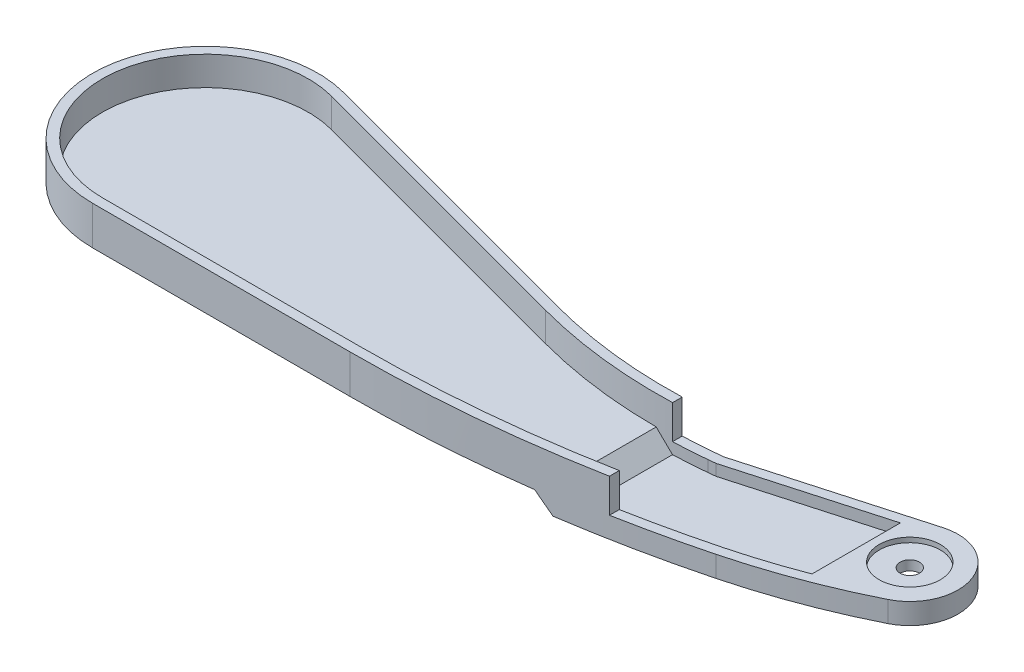
ISO-10303-21;
HEADER;
FILE_DESCRIPTION(('STEP AP214'),'2;1');
FILE_NAME('part.step','',(''),(''),'','','');
FILE_SCHEMA(('AUTOMOTIVE_DESIGN { 1 0 10303 214 1 1 1 1 }'));
ENDSEC;
DATA;
#1=APPLICATION_CONTEXT('core data for automotive mechanical design processes');
#2=APPLICATION_PROTOCOL_DEFINITION('international standard','automotive_design',2000,#1);
#3=PRODUCT_CONTEXT('',#1,'mechanical');
#4=PRODUCT('Part','Part','',(#3));
#5=PRODUCT_RELATED_PRODUCT_CATEGORY('part','',(#4));
#6=PRODUCT_DEFINITION_FORMATION('','',#4);
#7=PRODUCT_DEFINITION_CONTEXT('part definition',#1,'design');
#8=PRODUCT_DEFINITION('design','',#6,#7);
#9=PRODUCT_DEFINITION_SHAPE('','',#8);
#10=(LENGTH_UNIT() NAMED_UNIT(*) SI_UNIT(.MILLI.,.METRE.));
#11=(NAMED_UNIT(*) PLANE_ANGLE_UNIT() SI_UNIT($,.RADIAN.));
#12=(NAMED_UNIT(*) SI_UNIT($,.STERADIAN.) SOLID_ANGLE_UNIT());
#13=UNCERTAINTY_MEASURE_WITH_UNIT(LENGTH_MEASURE(1.E-05),#10,'distance_accuracy_value','');
#14=(GEOMETRIC_REPRESENTATION_CONTEXT(3) GLOBAL_UNCERTAINTY_ASSIGNED_CONTEXT((#13)) GLOBAL_UNIT_ASSIGNED_CONTEXT((#10,
#11,#12)) REPRESENTATION_CONTEXT('',''));
#15=CARTESIAN_POINT('',(0.,0.,0.));
#16=DIRECTION('',(0.,0.,1.));
#17=DIRECTION('',(1.,0.,0.));
#18=AXIS2_PLACEMENT_3D('',#15,#16,#17);
#19=CARTESIAN_POINT('',(212.918614133636,3.,-5.88759334632715));
#20=DIRECTION('',(0.,-1.,0.));
#21=DIRECTION('',(0.,0.,1.));
#22=AXIS2_PLACEMENT_3D('',#19,#20,#21);
#23=CYLINDRICAL_SURFACE('',#22,2.99999999999851);
#24=CARTESIAN_POINT('',(212.918614133636,0.,-5.88759334632715));
#25=DIRECTION('',(0.,-1.,0.));
#26=DIRECTION('',(0.,0.,-1.));
#27=AXIS2_PLACEMENT_3D('',#24,#25,#26);
#28=CIRCLE('',#27,2.9999999999982);
#29=CARTESIAN_POINT('',(212.918614133636,0.,-8.88759334632535));
#30=VERTEX_POINT('',#29);
#31=EDGE_CURVE('E1045',#30,#30,#28,.T.);
#32=ORIENTED_EDGE('',*,*,#31,.F.);
#33=EDGE_LOOP('',(#32));
#34=FACE_BOUND('',#33,.T.);
#35=CARTESIAN_POINT('',(212.918614133636,-3.,-5.88759334632715));
#36=DIRECTION('',(0.,1.,0.));
#37=DIRECTION('',(0.,0.,1.));
#38=AXIS2_PLACEMENT_3D('',#35,#36,#37);
#39=CIRCLE('',#38,2.99999999999851);
#40=CARTESIAN_POINT('',(212.918614133636,-3.,-2.88759334632864));
#41=VERTEX_POINT('',#40);
#42=EDGE_CURVE('E53',#41,#41,#39,.T.);
#43=ORIENTED_EDGE('',*,*,#42,.F.);
#44=EDGE_LOOP('',(#43));
#45=FACE_BOUND('',#44,.T.);
#46=ADVANCED_FACE('F49',(#34,#45),#23,.F.);
#47=CARTESIAN_POINT('',(130.358675059024,12.,-171.443796673164));
#48=DIRECTION('',(0.,-1.,0.));
#49=DIRECTION('',(0.,0.,1.));
#50=AXIS2_PLACEMENT_3D('',#47,#48,#49);
#51=CYLINDRICAL_SURFACE('',#50,197.);
#52=CARTESIAN_POINT('',(130.358675059024,-2.,-171.443796673164));
#53=DIRECTION('',(0.,-1.,0.));
#54=DIRECTION('',(0.,0.,-1.));
#55=AXIS2_PLACEMENT_3D('',#52,#53,#54);
#56=CIRCLE('',#55,197.);
#57=CARTESIAN_POINT('',(200.918614133637,-2.,12.4863395138867));
#58=VERTEX_POINT('',#57);
#59=CARTESIAN_POINT('',(179.961969992162,-2.,19.2090636037703));
#60=VERTEX_POINT('',#59);
#61=EDGE_CURVE('E284',#58,#60,#56,.T.);
#62=ORIENTED_EDGE('',*,*,#61,.T.);
#63=DIRECTION('',(0.,-1.,0.));
#64=VECTOR('',#63,1.);
#65=CARTESIAN_POINT('',(179.961969992162,12.,19.2090636037703));
#66=LINE('',#65,#64);
#67=CARTESIAN_POINT('',(179.961969992162,1.5,19.2090636037703));
#68=VERTEX_POINT('',#67);
#69=EDGE_CURVE('E398',#68,#60,#66,.T.);
#70=ORIENTED_EDGE('',*,*,#69,.F.);
#71=CARTESIAN_POINT('',(130.358675059024,1.5,-171.443796673164));
#72=DIRECTION('',(0.,-1.,0.));
#73=DIRECTION('',(0.,0.,-1.));
#74=AXIS2_PLACEMENT_3D('',#71,#72,#73);
#75=CIRCLE('',#74,197.);
#76=CARTESIAN_POINT('',(200.918614133637,1.5,12.4863395138867));
#77=VERTEX_POINT('',#76);
#78=EDGE_CURVE('E252',#68,#77,#75,.F.);
#79=ORIENTED_EDGE('',*,*,#78,.T.);
#80=DIRECTION('',(0.,-1.,0.));
#81=VECTOR('',#80,1.);
#82=CARTESIAN_POINT('',(200.918614133637,40.2114427191313,12.4863395138867));
#83=LINE('',#82,#81);
#84=EDGE_CURVE('E230',#77,#58,#83,.T.);
#85=ORIENTED_EDGE('',*,*,#84,.T.);
#86=EDGE_LOOP('',(#62,#70,#79,#85));
#87=FACE_BOUND('',#86,.T.);
#88=ADVANCED_FACE('F529',(#87),#51,.F.);
#89=CARTESIAN_POINT('',(10.9278641623068,12.,38.6918611036535));
#90=DIRECTION('',(0.2718005582062,0.,0.962353602663178));
#91=DIRECTION('',(-0.962353602663178,0.,0.2718005582062));
#92=AXIS2_PLACEMENT_3D('',#89,#90,#91);
#93=PLANE('',#92);
#94=DIRECTION('',(-0.962353602663178,0.,0.2718005582062));
#95=VECTOR('',#94,1.);
#96=CARTESIAN_POINT('',(10.9278641623068,1.5,38.6918611036535));
#97=LINE('',#96,#95);
#98=CARTESIAN_POINT('',(200.918614133638,1.5,-14.9678246431627));
#99=VERTEX_POINT('',#98);
#100=CARTESIAN_POINT('',(156.315281662602,1.5,-2.37036500885032));
#101=VERTEX_POINT('',#100);
#102=EDGE_CURVE('E241',#99,#101,#97,.T.);
#103=ORIENTED_EDGE('',*,*,#102,.T.);
#104=DIRECTION('',(0.,-1.,0.));
#105=VECTOR('',#104,1.);
#106=CARTESIAN_POINT('',(156.315281662602,12.,-2.37036500885031));
#107=LINE('',#106,#105);
#108=CARTESIAN_POINT('',(156.315281662602,-2.,-2.37036500885032));
#109=VERTEX_POINT('',#108);
#110=EDGE_CURVE('E395',#101,#109,#107,.T.);
#111=ORIENTED_EDGE('',*,*,#110,.T.);
#112=DIRECTION('',(0.962353602663178,0.,-0.2718005582062));
#113=VECTOR('',#112,1.);
#114=CARTESIAN_POINT('',(10.9278641623068,-2.,38.6918611036535));
#115=LINE('',#114,#113);
#116=CARTESIAN_POINT('',(200.918614133638,-2.,-14.9678246431627));
#117=VERTEX_POINT('',#116);
#118=EDGE_CURVE('E243',#109,#117,#115,.T.);
#119=ORIENTED_EDGE('',*,*,#118,.T.);
#120=DIRECTION('',(0.,-1.,0.));
#121=VECTOR('',#120,1.);
#122=CARTESIAN_POINT('',(200.918614133638,40.2114427191313,-14.9678246431627));
#123=LINE('',#122,#121);
#124=EDGE_CURVE('E227',#99,#117,#123,.T.);
#125=ORIENTED_EDGE('',*,*,#124,.F.);
#126=EDGE_LOOP('',(#103,#111,#119,#125));
#127=FACE_BOUND('',#126,.T.);
#128=ADVANCED_FACE('F239',(#127),#93,.T.);
#129=CARTESIAN_POINT('',(0.,-2.,0.));
#130=DIRECTION('',(0.,1.,0.));
#131=DIRECTION('',(0.,0.,-1.));
#132=AXIS2_PLACEMENT_3D('',#129,#130,#131);
#133=PLANE('',#132);
#134=ORIENTED_EDGE('',*,*,#118,.F.);
#135=DIRECTION('',(0.994930960663285,0.,-0.100560347620881));
#136=VECTOR('',#135,1.);
#137=CARTESIAN_POINT('',(1.34356362812454,-2.,13.2930432607676));
#138=LINE('',#137,#136);
#139=CARTESIAN_POINT('',(154.064284201128,-2.,-2.14285064235739));
#140=VERTEX_POINT('',#139);
#141=EDGE_CURVE('E295',#140,#109,#138,.T.);
#142=ORIENTED_EDGE('',*,*,#141,.F.);
#143=CARTESIAN_POINT('',(138.678551015139,-2.,-154.367287623841));
#144=DIRECTION('',(0.,-1.,0.));
#145=DIRECTION('',(0.,0.,-1.));
#146=AXIS2_PLACEMENT_3D('',#143,#144,#145);
#147=CIRCLE('',#146,153.);
#148=CARTESIAN_POINT('',(143.67855101514,-2.,-1.44900879491838));
#149=VERTEX_POINT('',#148);
#150=EDGE_CURVE('E292',#149,#140,#147,.F.);
#151=ORIENTED_EDGE('',*,*,#150,.F.);
#152=DIRECTION('',(0.,0.,-1.));
#153=VECTOR('',#152,1.);
#154=CARTESIAN_POINT('',(143.67855101514,-2.,-1.36728762384033));
#155=LINE('',#154,#153);
#156=CARTESIAN_POINT('',(143.678551015139,-2.,26.8597225291372));
#157=VERTEX_POINT('',#156);
#158=EDGE_CURVE('E59',#157,#149,#155,.T.);
#159=ORIENTED_EDGE('',*,*,#158,.F.);
#160=CARTESIAN_POINT('',(80.,-2.,-365.));
#161=DIRECTION('',(0.,-1.,0.));
#162=DIRECTION('',(0.,0.,-1.));
#163=AXIS2_PLACEMENT_3D('',#160,#161,#162);
#164=CIRCLE('',#163,397.);
#165=EDGE_CURVE('E288',#60,#157,#164,.T.);
#166=ORIENTED_EDGE('',*,*,#165,.F.);
#167=ORIENTED_EDGE('',*,*,#61,.F.);
#168=DIRECTION('',(0.,0.,-1.));
#169=VECTOR('',#168,1.);
#170=CARTESIAN_POINT('',(200.918614133638,-2.,8.73435102510271E-12));
#171=LINE('',#170,#169);
#172=EDGE_CURVE('E245',#58,#117,#171,.T.);
#173=ORIENTED_EDGE('',*,*,#172,.T.);
#174=EDGE_LOOP('',(#134,#142,#151,#159,#166,#167,#173));
#175=FACE_BOUND('',#174,.T.);
#176=ADVANCED_FACE('F475',(#175),#133,.T.);
#177=CARTESIAN_POINT('',(1.04188258526097,3.,10.3082503787722));
#178=DIRECTION('',(-0.100560347620846,0.,-0.994930960663289));
#179=DIRECTION('',(0.994930960663289,0.,-0.100560347620846));
#180=AXIS2_PLACEMENT_3D('',#177,#178,#179);
#181=PLANE('',#180);
#182=DIRECTION('',(0.,-1.,0.));
#183=VECTOR('',#182,1.);
#184=CARTESIAN_POINT('',(155.752465079592,3.,-5.32876421958903));
#185=LINE('',#184,#183);
#186=CARTESIAN_POINT('',(155.752465079592,1.5,-5.32876421958905));
#187=VERTEX_POINT('',#186);
#188=CARTESIAN_POINT('',(155.752465079592,-5.,-5.32876421958904));
#189=VERTEX_POINT('',#188);
#190=EDGE_CURVE('E440',#187,#189,#185,.T.);
#191=ORIENTED_EDGE('',*,*,#190,.T.);
#192=DIRECTION('',(-0.994930960663289,0.,0.100560347620846));
#193=VECTOR('',#192,1.);
#194=CARTESIAN_POINT('',(1.04188258526097,-5.,10.3082503787722));
#195=LINE('',#194,#193);
#196=CARTESIAN_POINT('',(153.762603158266,-5.,-5.12764352434727));
#197=VERTEX_POINT('',#196);
#198=EDGE_CURVE('E310',#189,#197,#195,.T.);
#199=ORIENTED_EDGE('',*,*,#198,.T.);
#200=DIRECTION('',(0.,-1.,0.));
#201=VECTOR('',#200,1.);
#202=CARTESIAN_POINT('',(153.762603158266,3.,-5.12764352434734));
#203=LINE('',#202,#201);
#204=CARTESIAN_POINT('',(153.762603158266,1.5,-5.12764352434734));
#205=VERTEX_POINT('',#204);
#206=EDGE_CURVE('E444',#205,#197,#203,.T.);
#207=ORIENTED_EDGE('',*,*,#206,.F.);
#208=DIRECTION('',(0.994930960663289,0.,-0.100560347620846));
#209=VECTOR('',#208,1.);
#210=CARTESIAN_POINT('',(1.04188258526097,1.5,10.3082503787722));
#211=LINE('',#210,#209);
#212=EDGE_CURVE('E499',#205,#187,#211,.T.);
#213=ORIENTED_EDGE('',*,*,#212,.T.);
#214=EDGE_LOOP('',(#191,#199,#207,#213));
#215=FACE_BOUND('',#214,.T.);
#216=ADVANCED_FACE('F572',(#215),#181,.T.);
#217=CARTESIAN_POINT('',(10.1124624876882,3.,35.804800295664));
#218=DIRECTION('',(-0.2718005582062,0.,-0.962353602663178));
#219=DIRECTION('',(0.962353602663178,0.,-0.2718005582062));
#220=AXIS2_PLACEMENT_3D('',#217,#218,#219);
#221=PLANE('',#220);
#222=DIRECTION('',(0.,-1.,0.));
#223=VECTOR('',#222,1.);
#224=CARTESIAN_POINT('',(208.841605760544,3.,-20.3228973862734));
#225=LINE('',#224,#223);
#226=CARTESIAN_POINT('',(208.841605760544,1.5,-20.3228973862734));
#227=VERTEX_POINT('',#226);
#228=CARTESIAN_POINT('',(208.841605760544,-5.,-20.3228973862734));
#229=VERTEX_POINT('',#228);
#230=EDGE_CURVE('E436',#227,#229,#225,.T.);
#231=ORIENTED_EDGE('',*,*,#230,.T.);
#232=DIRECTION('',(-0.962353602663178,0.,0.2718005582062));
#233=VECTOR('',#232,1.);
#234=CARTESIAN_POINT('',(10.1124624876882,-5.,35.804800295664));
#235=LINE('',#234,#233);
#236=EDGE_CURVE('E307',#229,#189,#235,.T.);
#237=ORIENTED_EDGE('',*,*,#236,.T.);
#238=ORIENTED_EDGE('',*,*,#190,.F.);
#239=DIRECTION('',(0.962353602663178,0.,-0.2718005582062));
#240=VECTOR('',#239,1.);
#241=CARTESIAN_POINT('',(10.1124624876882,1.5,35.804800295664));
#242=LINE('',#241,#240);
#243=EDGE_CURVE('E503',#187,#227,#242,.T.);
#244=ORIENTED_EDGE('',*,*,#243,.T.);
#245=EDGE_LOOP('',(#231,#237,#238,#244));
#246=FACE_BOUND('',#245,.T.);
#247=ADVANCED_FACE('F568',(#246),#221,.T.);
#248=CARTESIAN_POINT('',(212.918614133636,3.,-5.88759334632715));
#249=DIRECTION('',(0.,-1.,0.));
#250=DIRECTION('',(0.,0.,1.));
#251=AXIS2_PLACEMENT_3D('',#248,#249,#250);
#252=CYLINDRICAL_SURFACE('',#251,14.9999999999985);
#253=CARTESIAN_POINT('',(212.918614133636,1.5,-5.88759334632715));
#254=DIRECTION('',(0.,-1.,0.));
#255=DIRECTION('',(0.,0.,-1.));
#256=AXIS2_PLACEMENT_3D('',#253,#254,#255);
#257=CIRCLE('',#256,14.9999999999985);
#258=CARTESIAN_POINT('',(219.612663247794,1.5,7.5358825990906));
#259=VERTEX_POINT('',#258);
#260=EDGE_CURVE('E507',#227,#259,#257,.T.);
#261=ORIENTED_EDGE('',*,*,#260,.T.);
#262=DIRECTION('',(0.,-1.,0.));
#263=VECTOR('',#262,1.);
#264=CARTESIAN_POINT('',(219.612663247794,3.,7.53588259909058));
#265=LINE('',#264,#263);
#266=CARTESIAN_POINT('',(219.612663247794,-5.,7.53588259909059));
#267=VERTEX_POINT('',#266);
#268=EDGE_CURVE('E432',#259,#267,#265,.T.);
#269=ORIENTED_EDGE('',*,*,#268,.T.);
#270=CARTESIAN_POINT('',(212.918614133636,-5.,-5.88759334632715));
#271=DIRECTION('',(0.,1.,0.));
#272=DIRECTION('',(0.,0.,1.));
#273=AXIS2_PLACEMENT_3D('',#270,#271,#272);
#274=CIRCLE('',#273,14.9999999999985);
#275=EDGE_CURVE('E304',#267,#229,#274,.T.);
#276=ORIENTED_EDGE('',*,*,#275,.T.);
#277=ORIENTED_EDGE('',*,*,#230,.F.);
#278=EDGE_LOOP('',(#261,#269,#276,#277));
#279=FACE_BOUND('',#278,.T.);
#280=ADVANCED_FACE('F564',(#279),#252,.T.);
#281=CARTESIAN_POINT('',(130.358675059024,3.,-171.443796673164));
#282=DIRECTION('',(0.,-1.,0.));
#283=DIRECTION('',(0.,0.,1.));
#284=AXIS2_PLACEMENT_3D('',#281,#282,#283);
#285=CYLINDRICAL_SURFACE('',#284,200.);
#286=DIRECTION('',(0.,-1.,0.));
#287=VECTOR('',#286,1.);
#288=CARTESIAN_POINT('',(180.717350118048,3.,22.112406653673));
#289=LINE('',#288,#287);
#290=CARTESIAN_POINT('',(180.717350118048,1.5,22.1124066536729));
#291=VERTEX_POINT('',#290);
#292=CARTESIAN_POINT('',(180.717350118048,-5.,22.1124066536729));
#293=VERTEX_POINT('',#292);
#294=EDGE_CURVE('E428',#291,#293,#289,.T.);
#295=ORIENTED_EDGE('',*,*,#294,.T.);
#296=CARTESIAN_POINT('',(130.358675059024,-5.,-171.443796673164));
#297=DIRECTION('',(0.,1.,0.));
#298=DIRECTION('',(0.,0.,1.));
#299=AXIS2_PLACEMENT_3D('',#296,#297,#298);
#300=CIRCLE('',#299,200.);
#301=EDGE_CURVE('E298',#293,#267,#300,.T.);
#302=ORIENTED_EDGE('',*,*,#301,.T.);
#303=ORIENTED_EDGE('',*,*,#268,.F.);
#304=CARTESIAN_POINT('',(130.358675059024,1.5,-171.443796673164));
#305=DIRECTION('',(0.,-1.,0.));
#306=DIRECTION('',(0.,0.,-1.));
#307=AXIS2_PLACEMENT_3D('',#304,#305,#306);
#308=CIRCLE('',#307,200.);
#309=EDGE_CURVE('E511',#259,#291,#308,.T.);
#310=ORIENTED_EDGE('',*,*,#309,.T.);
#311=EDGE_LOOP('',(#295,#302,#303,#310));
#312=FACE_BOUND('',#311,.T.);
#313=ADVANCED_FACE('F561',(#312),#285,.T.);
#314=CARTESIAN_POINT('',(1.34356362812454,12.,13.2930432607676));
#315=DIRECTION('',(0.100560347620881,0.,0.994930960663285));
#316=DIRECTION('',(-0.994930960663285,0.,0.100560347620881));
#317=AXIS2_PLACEMENT_3D('',#314,#315,#316);
#318=PLANE('',#317);
#319=DIRECTION('',(0.,-1.,0.));
#320=VECTOR('',#319,1.);
#321=CARTESIAN_POINT('',(154.064284201128,12.,-2.14285064235739));
#322=LINE('',#321,#320);
#323=CARTESIAN_POINT('',(154.064284201128,1.5,-2.14285064235734));
#324=VERTEX_POINT('',#323);
#325=EDGE_CURVE('E392',#324,#140,#322,.T.);
#326=ORIENTED_EDGE('',*,*,#325,.T.);
#327=ORIENTED_EDGE('',*,*,#141,.T.);
#328=ORIENTED_EDGE('',*,*,#110,.F.);
#329=DIRECTION('',(-0.994930960663285,0.,0.100560347620881));
#330=VECTOR('',#329,1.);
#331=CARTESIAN_POINT('',(1.34356362812454,1.5,13.2930432607676));
#332=LINE('',#331,#330);
#333=EDGE_CURVE('E249',#101,#324,#332,.T.);
#334=ORIENTED_EDGE('',*,*,#333,.T.);
#335=EDGE_LOOP('',(#326,#327,#328,#334));
#336=FACE_BOUND('',#335,.T.);
#337=ADVANCED_FACE('F480',(#336),#318,.T.);
#338=CARTESIAN_POINT('',(0.,3.,0.));
#339=DIRECTION('',(0.,1.,0.));
#340=DIRECTION('',(0.,0.,-1.));
#341=AXIS2_PLACEMENT_3D('',#338,#339,#340);
#342=PLANE('',#341);
#343=CARTESIAN_POINT('',(138.678551015139,3.,-154.367287623841));
#344=DIRECTION('',(0.,-1.,0.));
#345=DIRECTION('',(0.,0.,-1.));
#346=AXIS2_PLACEMENT_3D('',#343,#344,#345);
#347=CIRCLE('',#346,153.);
#348=CARTESIAN_POINT('',(138.67855101514,3.,-1.36728762384056));
#349=VERTEX_POINT('',#348);
#350=CARTESIAN_POINT('',(99.0792371144531,3.,-6.58063620161312));
#351=VERTEX_POINT('',#350);
#352=EDGE_CURVE('E366',#349,#351,#347,.T.);
#353=ORIENTED_EDGE('',*,*,#352,.T.);
#354=DIRECTION('',(0.965925826289068,0.,0.258819045102522));
#355=VECTOR('',#354,1.);
#356=CARTESIAN_POINT('',(8.2822094432807,3.,-30.9096264412502));
#357=LINE('',#356,#355);
#358=CARTESIAN_POINT('',(8.28220944328072,3.,-30.9096264412502));
#359=VERTEX_POINT('',#358);
#360=EDGE_CURVE('E370',#359,#351,#357,.T.);
#361=ORIENTED_EDGE('',*,*,#360,.F.);
#362=CARTESIAN_POINT('',(0.,3.,0.));
#363=DIRECTION('',(0.,-1.,0.));
#364=DIRECTION('',(0.,0.,-1.));
#365=AXIS2_PLACEMENT_3D('',#362,#363,#364);
#366=CIRCLE('',#365,32.);
#367=CARTESIAN_POINT('',(0.,3.,32.));
#368=VERTEX_POINT('',#367);
#369=EDGE_CURVE('E374',#368,#359,#366,.T.);
#370=ORIENTED_EDGE('',*,*,#369,.F.);
#371=DIRECTION('',(-1.,0.,0.));
#372=VECTOR('',#371,1.);
#373=CARTESIAN_POINT('',(0.,3.,32.));
#374=LINE('',#373,#372);
#375=CARTESIAN_POINT('',(80.0000000000001,3.,32.));
#376=VERTEX_POINT('',#375);
#377=EDGE_CURVE('E330',#376,#368,#374,.T.);
#378=ORIENTED_EDGE('',*,*,#377,.F.);
#379=CARTESIAN_POINT('',(80.,3.,-365.));
#380=DIRECTION('',(0.,-1.,0.));
#381=DIRECTION('',(0.,0.,-1.));
#382=AXIS2_PLACEMENT_3D('',#379,#380,#381);
#383=CIRCLE('',#382,397.);
#384=CARTESIAN_POINT('',(138.678551015139,3.,27.6395645509553));
#385=VERTEX_POINT('',#384);
#386=EDGE_CURVE('E324',#385,#376,#383,.T.);
#387=ORIENTED_EDGE('',*,*,#386,.F.);
#388=DIRECTION('',(0.,0.,1.));
#389=VECTOR('',#388,1.);
#390=CARTESIAN_POINT('',(138.67855101514,3.,6.26139859950001E-12));
#391=LINE('',#390,#389);
#392=EDGE_CURVE('E272',#349,#385,#391,.T.);
#393=ORIENTED_EDGE('',*,*,#392,.F.);
#394=EDGE_LOOP('',(#353,#361,#370,#378,#387,#393));
#395=FACE_BOUND('',#394,.T.);
#396=ADVANCED_FACE('F544',(#395),#342,.T.);
#397=CARTESIAN_POINT('',(0.,0.,0.));
#398=DIRECTION('',(0.,1.,0.));
#399=DIRECTION('',(0.,0.,-1.));
#400=AXIS2_PLACEMENT_3D('',#397,#398,#399);
#401=PLANE('',#400);
#402=CARTESIAN_POINT('',(80.,0.,-365.));
#403=DIRECTION('',(0.,-1.,0.));
#404=DIRECTION('',(0.,0.,-1.));
#405=AXIS2_PLACEMENT_3D('',#402,#403,#404);
#406=CIRCLE('',#405,400.);
#407=CARTESIAN_POINT('',(80.,0.,35.));
#408=VERTEX_POINT('',#407);
#409=CARTESIAN_POINT('',(133.678551015139,0.,31.3819031703076));
#410=VERTEX_POINT('',#409);
#411=EDGE_CURVE('E414',#408,#410,#406,.F.);
#412=ORIENTED_EDGE('',*,*,#411,.F.);
#413=DIRECTION('',(1.,0.,0.));
#414=VECTOR('',#413,1.);
#415=CARTESIAN_POINT('',(0.,0.,35.));
#416=LINE('',#415,#414);
#417=CARTESIAN_POINT('',(0.,0.,35.));
#418=VERTEX_POINT('',#417);
#419=EDGE_CURVE('E418',#418,#408,#416,.T.);
#420=ORIENTED_EDGE('',*,*,#419,.F.);
#421=CARTESIAN_POINT('',(0.,0.,0.));
#422=DIRECTION('',(0.,-1.,0.));
#423=DIRECTION('',(0.,0.,-1.));
#424=AXIS2_PLACEMENT_3D('',#421,#422,#423);
#425=CIRCLE('',#424,35.);
#426=CARTESIAN_POINT('',(9.05866657858827,0.,-33.8074039201174));
#427=VERTEX_POINT('',#426);
#428=EDGE_CURVE('E402',#418,#427,#425,.T.);
#429=ORIENTED_EDGE('',*,*,#428,.T.);
#430=DIRECTION('',(0.965925826289068,0.,0.258819045102522));
#431=VECTOR('',#430,1.);
#432=CARTESIAN_POINT('',(9.05866657858827,0.,-33.8074039201174));
#433=LINE('',#432,#431);
#434=CARTESIAN_POINT('',(99.8556942497606,0.,-9.47841368048033));
#435=VERTEX_POINT('',#434);
#436=EDGE_CURVE('E406',#427,#435,#433,.T.);
#437=ORIENTED_EDGE('',*,*,#436,.T.);
#438=CARTESIAN_POINT('',(138.678551015139,0.,-154.367287623841));
#439=DIRECTION('',(0.,-1.,0.));
#440=DIRECTION('',(0.,0.,-1.));
#441=AXIS2_PLACEMENT_3D('',#438,#439,#440);
#442=CIRCLE('',#441,150.);
#443=CARTESIAN_POINT('',(133.678551015141,0.,-4.45064411819107));
#444=VERTEX_POINT('',#443);
#445=EDGE_CURVE('E410',#435,#444,#442,.F.);
#446=ORIENTED_EDGE('',*,*,#445,.T.);
#447=DIRECTION('',(0.,0.,-1.));
#448=VECTOR('',#447,1.);
#449=CARTESIAN_POINT('',(133.678551015141,0.,-4.36728762384084));
#450=LINE('',#449,#448);
#451=EDGE_CURVE('E454',#410,#444,#450,.T.);
#452=ORIENTED_EDGE('',*,*,#451,.F.);
#453=EDGE_LOOP('',(#412,#420,#429,#437,#446,#452));
#454=FACE_BOUND('',#453,.T.);
#455=ADVANCED_FACE('F547',(#454),#401,.F.);
#456=CARTESIAN_POINT('',(0.,3.,0.));
#457=DIRECTION('',(0.,-1.,0.));
#458=DIRECTION('',(0.,0.,1.));
#459=AXIS2_PLACEMENT_3D('',#456,#457,#458);
#460=CYLINDRICAL_SURFACE('',#459,35.);
#461=ORIENTED_EDGE('',*,*,#428,.F.);
#462=DIRECTION('',(0.,-1.,0.));
#463=VECTOR('',#462,1.);
#464=CARTESIAN_POINT('',(0.,3.,35.));
#465=LINE('',#464,#463);
#466=CARTESIAN_POINT('',(0.,12.,35.));
#467=VERTEX_POINT('',#466);
#468=EDGE_CURVE('E422',#467,#418,#465,.T.);
#469=ORIENTED_EDGE('',*,*,#468,.F.);
#470=CARTESIAN_POINT('',(0.,12.,0.));
#471=DIRECTION('',(0.,-1.,0.));
#472=DIRECTION('',(0.,0.,-1.));
#473=AXIS2_PLACEMENT_3D('',#470,#471,#472);
#474=CIRCLE('',#473,35.);
#475=CARTESIAN_POINT('',(9.05866657858827,12.,-33.8074039201174));
#476=VERTEX_POINT('',#475);
#477=EDGE_CURVE('E346',#467,#476,#474,.T.);
#478=ORIENTED_EDGE('',*,*,#477,.T.);
#479=DIRECTION('',(0.,-1.,0.));
#480=VECTOR('',#479,1.);
#481=CARTESIAN_POINT('',(9.05866657858827,3.,-33.8074039201174));
#482=LINE('',#481,#480);
#483=EDGE_CURVE('E451',#476,#427,#482,.T.);
#484=ORIENTED_EDGE('',*,*,#483,.T.);
#485=EDGE_LOOP('',(#461,#469,#478,#484));
#486=FACE_BOUND('',#485,.T.);
#487=ADVANCED_FACE('F550',(#486),#460,.T.);
#488=CARTESIAN_POINT('',(9.05866657858827,3.,-33.8074039201174));
#489=DIRECTION('',(-0.258819045102522,0.,0.965925826289068));
#490=DIRECTION('',(-0.965925826289068,0.,-0.258819045102522));
#491=AXIS2_PLACEMENT_3D('',#488,#489,#490);
#492=PLANE('',#491);
#493=ORIENTED_EDGE('',*,*,#436,.F.);
#494=ORIENTED_EDGE('',*,*,#483,.F.);
#495=DIRECTION('',(0.965925826289068,0.,0.258819045102522));
#496=VECTOR('',#495,1.);
#497=CARTESIAN_POINT('',(9.05866657858827,12.,-33.8074039201174));
#498=LINE('',#497,#496);
#499=CARTESIAN_POINT('',(99.8556942497607,12.,-9.47841368048041));
#500=VERTEX_POINT('',#499);
#501=EDGE_CURVE('E350',#476,#500,#498,.T.);
#502=ORIENTED_EDGE('',*,*,#501,.T.);
#503=DIRECTION('',(0.,-1.,0.));
#504=VECTOR('',#503,1.);
#505=CARTESIAN_POINT('',(99.8556942497606,3.,-9.47841368048033));
#506=LINE('',#505,#504);
#507=EDGE_CURVE('E448',#500,#435,#506,.T.);
#508=ORIENTED_EDGE('',*,*,#507,.T.);
#509=EDGE_LOOP('',(#493,#494,#502,#508));
#510=FACE_BOUND('',#509,.T.);
#511=ADVANCED_FACE('F579',(#510),#492,.F.);
#512=CARTESIAN_POINT('',(138.678551015139,3.,-154.367287623841));
#513=DIRECTION('',(0.,-1.,0.));
#514=DIRECTION('',(0.,0.,1.));
#515=AXIS2_PLACEMENT_3D('',#512,#513,#514);
#516=CYLINDRICAL_SURFACE('',#515,150.);
#517=CARTESIAN_POINT('',(138.678551015139,1.5,-154.367287623841));
#518=DIRECTION('',(0.,-1.,0.));
#519=DIRECTION('',(0.,0.,-1.));
#520=AXIS2_PLACEMENT_3D('',#517,#518,#519);
#521=CIRCLE('',#520,150.);
#522=CARTESIAN_POINT('',(143.67855101514,1.5,-4.45064411819116));
#523=VERTEX_POINT('',#522);
#524=EDGE_CURVE('E496',#523,#205,#521,.F.);
#525=ORIENTED_EDGE('',*,*,#524,.T.);
#526=ORIENTED_EDGE('',*,*,#206,.T.);
#527=CARTESIAN_POINT('',(138.678551015139,-5.,-154.367287623841));
#528=DIRECTION('',(0.,1.,0.));
#529=DIRECTION('',(0.,0.,1.));
#530=AXIS2_PLACEMENT_3D('',#527,#528,#529);
#531=CIRCLE('',#530,150.);
#532=CARTESIAN_POINT('',(138.67855101514,-5.,-4.36728762384062));
#533=VERTEX_POINT('',#532);
#534=EDGE_CURVE('E314',#197,#533,#531,.F.);
#535=ORIENTED_EDGE('',*,*,#534,.T.);
#536=CARTESIAN_POINT('',(138.678551015139,-4.99999999999165,-154.367287623841));
#537=DIRECTION('',(0.707106781186551,0.707106781186544,0.));
#538=DIRECTION('',(0.707106781186544,-0.707106781186551,0.));
#539=AXIS2_PLACEMENT_3D('',#536,#537,#538);
#540=ELLIPSE('',#539,212.132034355965,150.);
#541=EDGE_CURVE('E461',#444,#533,#540,.T.);
#542=ORIENTED_EDGE('',*,*,#541,.F.);
#543=ORIENTED_EDGE('',*,*,#445,.F.);
#544=ORIENTED_EDGE('',*,*,#507,.F.);
#545=CARTESIAN_POINT('',(138.678551015139,12.,-154.367287623841));
#546=DIRECTION('',(0.,-1.,0.));
#547=DIRECTION('',(0.,0.,-1.));
#548=AXIS2_PLACEMENT_3D('',#545,#546,#547);
#549=CIRCLE('',#548,150.);
#550=CARTESIAN_POINT('',(143.67855101514,12.,-4.45064411819116));
#551=VERTEX_POINT('',#550);
#552=EDGE_CURVE('E354',#500,#551,#549,.F.);
#553=ORIENTED_EDGE('',*,*,#552,.T.);
#554=DIRECTION('',(0.,1.,0.));
#555=VECTOR('',#554,1.);
#556=CARTESIAN_POINT('',(143.67855101514,1.5,-4.45064411819116));
#557=LINE('',#556,#555);
#558=EDGE_CURVE('E277',#523,#551,#557,.T.);
#559=ORIENTED_EDGE('',*,*,#558,.F.);
#560=EDGE_LOOP('',(#525,#526,#535,#542,#543,#544,#553,#559));
#561=FACE_BOUND('',#560,.T.);
#562=ADVANCED_FACE('F559',(#561),#516,.F.);
#563=CARTESIAN_POINT('',(80.,3.,-365.));
#564=DIRECTION('',(0.,-1.,0.));
#565=DIRECTION('',(0.,0.,1.));
#566=AXIS2_PLACEMENT_3D('',#563,#564,#565);
#567=CYLINDRICAL_SURFACE('',#566,400.);
#568=DIRECTION('',(0.,1.,0.));
#569=VECTOR('',#568,1.);
#570=CARTESIAN_POINT('',(153.678551015139,1.5,28.1557847982268));
#571=LINE('',#570,#569);
#572=CARTESIAN_POINT('',(153.678551015139,1.5,28.1557847982268));
#573=VERTEX_POINT('',#572);
#574=CARTESIAN_POINT('',(153.678551015139,12.,28.1557847982268));
#575=VERTEX_POINT('',#574);
#576=EDGE_CURVE('E273',#573,#575,#571,.T.);
#577=ORIENTED_EDGE('',*,*,#576,.T.);
#578=CARTESIAN_POINT('',(80.,12.,-365.));
#579=DIRECTION('',(0.,-1.,0.));
#580=DIRECTION('',(0.,0.,-1.));
#581=AXIS2_PLACEMENT_3D('',#578,#579,#580);
#582=CIRCLE('',#581,400.);
#583=CARTESIAN_POINT('',(80.,12.,35.));
#584=VERTEX_POINT('',#583);
#585=EDGE_CURVE('E358',#575,#584,#582,.T.);
#586=ORIENTED_EDGE('',*,*,#585,.T.);
#587=DIRECTION('',(0.,-1.,0.));
#588=VECTOR('',#587,1.);
#589=CARTESIAN_POINT('',(80.,3.,35.));
#590=LINE('',#589,#588);
#591=EDGE_CURVE('E425',#584,#408,#590,.T.);
#592=ORIENTED_EDGE('',*,*,#591,.T.);
#593=ORIENTED_EDGE('',*,*,#411,.T.);
#594=CARTESIAN_POINT('',(80.,53.6785510151574,-365.));
#595=DIRECTION('',(0.707106781186551,0.707106781186544,0.));
#596=DIRECTION('',(0.707106781186544,-0.707106781186551,0.));
#597=AXIS2_PLACEMENT_3D('',#594,#595,#596);
#598=ELLIPSE('',#597,565.685424949241,400.);
#599=CARTESIAN_POINT('',(138.678551015139,-5.,30.6726268656499));
#600=VERTEX_POINT('',#599);
#601=EDGE_CURVE('E458',#600,#410,#598,.F.);
#602=ORIENTED_EDGE('',*,*,#601,.F.);
#603=CARTESIAN_POINT('',(80.,-5.,-365.));
#604=DIRECTION('',(0.,1.,0.));
#605=DIRECTION('',(0.,0.,1.));
#606=AXIS2_PLACEMENT_3D('',#603,#604,#605);
#607=CIRCLE('',#606,400.);
#608=EDGE_CURVE('E321',#600,#293,#607,.T.);
#609=ORIENTED_EDGE('',*,*,#608,.T.);
#610=ORIENTED_EDGE('',*,*,#294,.F.);
#611=CARTESIAN_POINT('',(80.,1.5,-365.));
#612=DIRECTION('',(0.,-1.,0.));
#613=DIRECTION('',(0.,0.,-1.));
#614=AXIS2_PLACEMENT_3D('',#611,#612,#613);
#615=CIRCLE('',#614,400.);
#616=EDGE_CURVE('E515',#291,#573,#615,.T.);
#617=ORIENTED_EDGE('',*,*,#616,.T.);
#618=EDGE_LOOP('',(#577,#586,#592,#593,#602,#609,#610,#617));
#619=FACE_BOUND('',#618,.T.);
#620=ADVANCED_FACE('F555',(#619),#567,.T.);
#621=CARTESIAN_POINT('',(0.,3.,35.));
#622=DIRECTION('',(0.,0.,1.));
#623=DIRECTION('',(-1.,0.,0.));
#624=AXIS2_PLACEMENT_3D('',#621,#622,#623);
#625=PLANE('',#624);
#626=ORIENTED_EDGE('',*,*,#419,.T.);
#627=ORIENTED_EDGE('',*,*,#591,.F.);
#628=DIRECTION('',(-1.,0.,0.));
#629=VECTOR('',#628,1.);
#630=CARTESIAN_POINT('',(0.,12.,35.));
#631=LINE('',#630,#629);
#632=EDGE_CURVE('E343',#584,#467,#631,.T.);
#633=ORIENTED_EDGE('',*,*,#632,.T.);
#634=ORIENTED_EDGE('',*,*,#468,.T.);
#635=EDGE_LOOP('',(#626,#627,#633,#634));
#636=FACE_BOUND('',#635,.T.);
#637=ADVANCED_FACE('F543',(#636),#625,.T.);
#638=CARTESIAN_POINT('',(80.,12.,-365.));
#639=DIRECTION('',(0.,-1.,0.));
#640=DIRECTION('',(0.,0.,1.));
#641=AXIS2_PLACEMENT_3D('',#638,#639,#640);
#642=CYLINDRICAL_SURFACE('',#641,397.);
#643=DIRECTION('',(0.,1.,0.));
#644=VECTOR('',#643,1.);
#645=CARTESIAN_POINT('',(153.678551015139,1.5,25.1031544608549));
#646=LINE('',#645,#644);
#647=CARTESIAN_POINT('',(153.678551015139,1.5,25.1031544608549));
#648=VERTEX_POINT('',#647);
#649=CARTESIAN_POINT('',(153.678551015139,12.,25.1031544608549));
#650=VERTEX_POINT('',#649);
#651=EDGE_CURVE('E268',#648,#650,#646,.T.);
#652=ORIENTED_EDGE('',*,*,#651,.F.);
#653=CARTESIAN_POINT('',(80.,1.5,-365.));
#654=DIRECTION('',(0.,-1.,0.));
#655=DIRECTION('',(0.,0.,-1.));
#656=AXIS2_PLACEMENT_3D('',#653,#654,#655);
#657=CIRCLE('',#656,397.);
#658=EDGE_CURVE('E258',#648,#68,#657,.F.);
#659=ORIENTED_EDGE('',*,*,#658,.T.);
#660=ORIENTED_EDGE('',*,*,#69,.T.);
#661=ORIENTED_EDGE('',*,*,#165,.T.);
#662=CARTESIAN_POINT('',(80.,61.6785510151574,-365.));
#663=DIRECTION('',(-0.707106781186551,-0.707106781186544,0.));
#664=DIRECTION('',(0.707106781186544,-0.707106781186551,0.));
#665=AXIS2_PLACEMENT_3D('',#662,#663,#664);
#666=ELLIPSE('',#665,561.442784262122,397.);
#667=EDGE_CURVE('E465',#385,#157,#666,.F.);
#668=ORIENTED_EDGE('',*,*,#667,.F.);
#669=ORIENTED_EDGE('',*,*,#386,.T.);
#670=DIRECTION('',(0.,-1.,0.));
#671=VECTOR('',#670,1.);
#672=CARTESIAN_POINT('',(80.0000000000001,12.,32.));
#673=LINE('',#672,#671);
#674=CARTESIAN_POINT('',(80.0000000000001,12.,32.));
#675=VERTEX_POINT('',#674);
#676=EDGE_CURVE('E362',#675,#376,#673,.T.);
#677=ORIENTED_EDGE('',*,*,#676,.F.);
#678=CARTESIAN_POINT('',(80.,12.,-365.));
#679=DIRECTION('',(0.,-1.,0.));
#680=DIRECTION('',(0.,0.,-1.));
#681=AXIS2_PLACEMENT_3D('',#678,#679,#680);
#682=CIRCLE('',#681,397.);
#683=EDGE_CURVE('E325',#650,#675,#682,.T.);
#684=ORIENTED_EDGE('',*,*,#683,.F.);
#685=EDGE_LOOP('',(#652,#659,#660,#661,#668,#669,#677,#684));
#686=FACE_BOUND('',#685,.T.);
#687=ADVANCED_FACE('F525',(#686),#642,.F.);
#688=CARTESIAN_POINT('',(138.678551015139,12.,-154.367287623841));
#689=DIRECTION('',(0.,-1.,0.));
#690=DIRECTION('',(0.,0.,1.));
#691=AXIS2_PLACEMENT_3D('',#688,#689,#690);
#692=CYLINDRICAL_SURFACE('',#691,153.);
#693=CARTESIAN_POINT('',(138.678551015139,12.,-154.367287623841));
#694=DIRECTION('',(0.,-1.,0.));
#695=DIRECTION('',(0.,0.,-1.));
#696=AXIS2_PLACEMENT_3D('',#693,#694,#695);
#697=CIRCLE('',#696,153.);
#698=CARTESIAN_POINT('',(143.67855101514,12.,-1.44900879491838));
#699=VERTEX_POINT('',#698);
#700=CARTESIAN_POINT('',(99.0792371144531,12.,-6.58063620161312));
#701=VERTEX_POINT('',#700);
#702=EDGE_CURVE('E329',#699,#701,#697,.T.);
#703=ORIENTED_EDGE('',*,*,#702,.T.);
#704=DIRECTION('',(0.,-1.,0.));
#705=VECTOR('',#704,1.);
#706=CARTESIAN_POINT('',(99.0792371144531,12.,-6.58063620161312));
#707=LINE('',#706,#705);
#708=EDGE_CURVE('E389',#701,#351,#707,.T.);
#709=ORIENTED_EDGE('',*,*,#708,.T.);
#710=ORIENTED_EDGE('',*,*,#352,.F.);
#711=CARTESIAN_POINT('',(138.678551015139,3.00000000000836,-154.367287623841));
#712=DIRECTION('',(-0.707106781186551,-0.707106781186544,0.));
#713=DIRECTION('',(0.707106781186544,-0.707106781186551,0.));
#714=AXIS2_PLACEMENT_3D('',#711,#712,#713);
#715=ELLIPSE('',#714,216.374675043085,153.);
#716=EDGE_CURVE('E11',#149,#349,#715,.T.);
#717=ORIENTED_EDGE('',*,*,#716,.F.);
#718=ORIENTED_EDGE('',*,*,#150,.T.);
#719=ORIENTED_EDGE('',*,*,#325,.F.);
#720=CARTESIAN_POINT('',(138.678551015139,1.5,-154.367287623841));
#721=DIRECTION('',(0.,-1.,0.));
#722=DIRECTION('',(0.,0.,-1.));
#723=AXIS2_PLACEMENT_3D('',#720,#721,#722);
#724=CIRCLE('',#723,153.);
#725=CARTESIAN_POINT('',(143.67855101514,1.5,-1.44900879491838));
#726=VERTEX_POINT('',#725);
#727=EDGE_CURVE('E267',#324,#726,#724,.T.);
#728=ORIENTED_EDGE('',*,*,#727,.T.);
#729=DIRECTION('',(0.,1.,0.));
#730=VECTOR('',#729,1.);
#731=CARTESIAN_POINT('',(143.67855101514,1.5,-1.44900879491838));
#732=LINE('',#731,#730);
#733=EDGE_CURVE('E256',#726,#699,#732,.T.);
#734=ORIENTED_EDGE('',*,*,#733,.T.);
#735=EDGE_LOOP('',(#703,#709,#710,#717,#718,#719,#728,#734));
#736=FACE_BOUND('',#735,.T.);
#737=ADVANCED_FACE('F477',(#736),#692,.T.);
#738=CARTESIAN_POINT('',(8.2822094432807,12.,-30.9096264412502));
#739=DIRECTION('',(-0.258819045102522,0.,0.965925826289068));
#740=DIRECTION('',(-0.965925826289068,0.,-0.258819045102522));
#741=AXIS2_PLACEMENT_3D('',#738,#739,#740);
#742=PLANE('',#741);
#743=ORIENTED_EDGE('',*,*,#360,.T.);
#744=ORIENTED_EDGE('',*,*,#708,.F.);
#745=DIRECTION('',(0.965925826289068,0.,0.258819045102522));
#746=VECTOR('',#745,1.);
#747=CARTESIAN_POINT('',(8.2822094432807,12.,-30.9096264412502));
#748=LINE('',#747,#746);
#749=CARTESIAN_POINT('',(8.28220944328072,12.,-30.9096264412502));
#750=VERTEX_POINT('',#749);
#751=EDGE_CURVE('E334',#750,#701,#748,.T.);
#752=ORIENTED_EDGE('',*,*,#751,.F.);
#753=DIRECTION('',(0.,-1.,0.));
#754=VECTOR('',#753,1.);
#755=CARTESIAN_POINT('',(8.28220944328072,12.,-30.9096264412502));
#756=LINE('',#755,#754);
#757=EDGE_CURVE('E386',#750,#359,#756,.T.);
#758=ORIENTED_EDGE('',*,*,#757,.T.);
#759=EDGE_LOOP('',(#743,#744,#752,#758));
#760=FACE_BOUND('',#759,.T.);
#761=ADVANCED_FACE('F645',(#760),#742,.T.);
#762=CARTESIAN_POINT('',(0.,12.,0.));
#763=DIRECTION('',(0.,-1.,0.));
#764=DIRECTION('',(0.,0.,1.));
#765=AXIS2_PLACEMENT_3D('',#762,#763,#764);
#766=CYLINDRICAL_SURFACE('',#765,32.);
#767=ORIENTED_EDGE('',*,*,#369,.T.);
#768=ORIENTED_EDGE('',*,*,#757,.F.);
#769=CARTESIAN_POINT('',(0.,12.,0.));
#770=DIRECTION('',(0.,-1.,0.));
#771=DIRECTION('',(0.,0.,-1.));
#772=AXIS2_PLACEMENT_3D('',#769,#770,#771);
#773=CIRCLE('',#772,32.);
#774=CARTESIAN_POINT('',(0.,12.,32.));
#775=VERTEX_POINT('',#774);
#776=EDGE_CURVE('E337',#775,#750,#773,.T.);
#777=ORIENTED_EDGE('',*,*,#776,.F.);
#778=DIRECTION('',(0.,-1.,0.));
#779=VECTOR('',#778,1.);
#780=CARTESIAN_POINT('',(0.,12.,32.));
#781=LINE('',#780,#779);
#782=EDGE_CURVE('E383',#775,#368,#781,.T.);
#783=ORIENTED_EDGE('',*,*,#782,.T.);
#784=EDGE_LOOP('',(#767,#768,#777,#783));
#785=FACE_BOUND('',#784,.T.);
#786=ADVANCED_FACE('F642',(#785),#766,.F.);
#787=CARTESIAN_POINT('',(0.,12.,32.));
#788=DIRECTION('',(0.,0.,-1.));
#789=DIRECTION('',(1.,0.,0.));
#790=AXIS2_PLACEMENT_3D('',#787,#788,#789);
#791=PLANE('',#790);
#792=ORIENTED_EDGE('',*,*,#377,.T.);
#793=ORIENTED_EDGE('',*,*,#782,.F.);
#794=DIRECTION('',(-1.,0.,0.));
#795=VECTOR('',#794,1.);
#796=CARTESIAN_POINT('',(0.,12.,32.));
#797=LINE('',#796,#795);
#798=EDGE_CURVE('E340',#675,#775,#797,.T.);
#799=ORIENTED_EDGE('',*,*,#798,.F.);
#800=ORIENTED_EDGE('',*,*,#676,.T.);
#801=EDGE_LOOP('',(#792,#793,#799,#800));
#802=FACE_BOUND('',#801,.T.);
#803=ADVANCED_FACE('F634',(#802),#791,.T.);
#804=CARTESIAN_POINT('',(0.,12.,0.));
#805=DIRECTION('',(0.,1.,0.));
#806=DIRECTION('',(0.,0.,-1.));
#807=AXIS2_PLACEMENT_3D('',#804,#805,#806);
#808=PLANE('',#807);
#809=DIRECTION('',(0.,0.,-1.));
#810=VECTOR('',#809,1.);
#811=CARTESIAN_POINT('',(153.678551015139,12.,0.));
#812=LINE('',#811,#810);
#813=EDGE_CURVE('E264',#575,#650,#812,.T.);
#814=ORIENTED_EDGE('',*,*,#813,.T.);
#815=ORIENTED_EDGE('',*,*,#683,.T.);
#816=ORIENTED_EDGE('',*,*,#798,.T.);
#817=ORIENTED_EDGE('',*,*,#776,.T.);
#818=ORIENTED_EDGE('',*,*,#751,.T.);
#819=ORIENTED_EDGE('',*,*,#702,.F.);
#820=DIRECTION('',(0.,0.,-1.));
#821=VECTOR('',#820,1.);
#822=CARTESIAN_POINT('',(143.67855101514,12.,0.));
#823=LINE('',#822,#821);
#824=EDGE_CURVE('E66',#699,#551,#823,.T.);
#825=ORIENTED_EDGE('',*,*,#824,.T.);
#826=ORIENTED_EDGE('',*,*,#552,.F.);
#827=ORIENTED_EDGE('',*,*,#501,.F.);
#828=ORIENTED_EDGE('',*,*,#477,.F.);
#829=ORIENTED_EDGE('',*,*,#632,.F.);
#830=ORIENTED_EDGE('',*,*,#585,.F.);
#831=EDGE_LOOP('',(#814,#815,#816,#817,#818,#819,#825,#826,#827,#828,#829,#830));
#832=FACE_BOUND('',#831,.T.);
#833=ADVANCED_FACE('F595',(#832),#808,.T.);
#834=CARTESIAN_POINT('',(0.,-5.,0.));
#835=DIRECTION('',(0.,-1.,0.));
#836=DIRECTION('',(0.,0.,1.));
#837=AXIS2_PLACEMENT_3D('',#834,#835,#836);
#838=PLANE('',#837);
#839=CARTESIAN_POINT('',(212.918614133636,-5.,-5.88759334632814));
#840=DIRECTION('',(0.,1.,0.));
#841=DIRECTION('',(0.,0.,1.));
#842=AXIS2_PLACEMENT_3D('',#839,#840,#841);
#843=CIRCLE('',#842,7.00000000000001);
#844=CARTESIAN_POINT('',(212.918614133636,-5.,1.11240665367187));
#845=VERTEX_POINT('',#844);
#846=EDGE_CURVE('E1041',#845,#845,#843,.T.);
#847=ORIENTED_EDGE('',*,*,#846,.T.);
#848=EDGE_LOOP('',(#847));
#849=FACE_BOUND('',#848,.T.);
#850=ORIENTED_EDGE('',*,*,#301,.F.);
#851=ORIENTED_EDGE('',*,*,#608,.F.);
#852=DIRECTION('',(0.,0.,1.));
#853=VECTOR('',#852,1.);
#854=CARTESIAN_POINT('',(138.67855101514,-5.,6.26139859950001E-12));
#855=LINE('',#854,#853);
#856=EDGE_CURVE('E318',#533,#600,#855,.T.);
#857=ORIENTED_EDGE('',*,*,#856,.F.);
#858=ORIENTED_EDGE('',*,*,#534,.F.);
#859=ORIENTED_EDGE('',*,*,#198,.F.);
#860=ORIENTED_EDGE('',*,*,#236,.F.);
#861=ORIENTED_EDGE('',*,*,#275,.F.);
#862=EDGE_LOOP('',(#850,#851,#857,#858,#859,#860,#861));
#863=FACE_BOUND('',#862,.T.);
#864=ADVANCED_FACE('F588',(#849,#863),#838,.T.);
#865=CARTESIAN_POINT('',(138.67855101514,-5.,6.26139859950001E-12));
#866=DIRECTION('',(-0.707106781186551,-0.707106781186544,0.));
#867=DIRECTION('',(0.,0.,-1.));
#868=AXIS2_PLACEMENT_3D('',#865,#866,#867);
#869=PLANE('',#868);
#870=ORIENTED_EDGE('',*,*,#541,.T.);
#871=ORIENTED_EDGE('',*,*,#856,.T.);
#872=ORIENTED_EDGE('',*,*,#601,.T.);
#873=ORIENTED_EDGE('',*,*,#451,.T.);
#874=EDGE_LOOP('',(#870,#871,#872,#873));
#875=FACE_BOUND('',#874,.T.);
#876=ADVANCED_FACE('F586',(#875),#869,.T.);
#877=CARTESIAN_POINT('',(138.67855101514,3.,6.26139859950001E-12));
#878=DIRECTION('',(0.707106781186551,0.707106781186544,0.));
#879=DIRECTION('',(0.,0.,-1.));
#880=AXIS2_PLACEMENT_3D('',#877,#878,#879);
#881=PLANE('',#880);
#882=ORIENTED_EDGE('',*,*,#716,.T.);
#883=ORIENTED_EDGE('',*,*,#392,.T.);
#884=ORIENTED_EDGE('',*,*,#667,.T.);
#885=ORIENTED_EDGE('',*,*,#158,.T.);
#886=EDGE_LOOP('',(#882,#883,#884,#885));
#887=FACE_BOUND('',#886,.T.);
#888=ADVANCED_FACE('F51',(#887),#881,.T.);
#889=CARTESIAN_POINT('',(153.678551015139,1.5,0.));
#890=DIRECTION('',(-1.,0.,0.));
#891=DIRECTION('',(0.,0.,-1.));
#892=AXIS2_PLACEMENT_3D('',#889,#890,#891);
#893=PLANE('',#892);
#894=ORIENTED_EDGE('',*,*,#813,.F.);
#895=ORIENTED_EDGE('',*,*,#576,.F.);
#896=DIRECTION('',(0.,0.,-1.));
#897=VECTOR('',#896,1.);
#898=CARTESIAN_POINT('',(153.678551015139,1.5,0.));
#899=LINE('',#898,#897);
#900=EDGE_CURVE('E519',#573,#648,#899,.T.);
#901=ORIENTED_EDGE('',*,*,#900,.T.);
#902=ORIENTED_EDGE('',*,*,#651,.T.);
#903=EDGE_LOOP('',(#894,#895,#901,#902));
#904=FACE_BOUND('',#903,.T.);
#905=ADVANCED_FACE('F594',(#904),#893,.F.);
#906=CARTESIAN_POINT('',(143.67855101514,1.5,0.));
#907=DIRECTION('',(-1.,0.,0.));
#908=DIRECTION('',(0.,0.,-1.));
#909=AXIS2_PLACEMENT_3D('',#906,#907,#908);
#910=PLANE('',#909);
#911=ORIENTED_EDGE('',*,*,#824,.F.);
#912=ORIENTED_EDGE('',*,*,#733,.F.);
#913=DIRECTION('',(0.,0.,-1.));
#914=VECTOR('',#913,1.);
#915=CARTESIAN_POINT('',(143.67855101514,1.5,0.));
#916=LINE('',#915,#914);
#917=EDGE_CURVE('E493',#726,#523,#916,.T.);
#918=ORIENTED_EDGE('',*,*,#917,.T.);
#919=ORIENTED_EDGE('',*,*,#558,.T.);
#920=EDGE_LOOP('',(#911,#912,#918,#919));
#921=FACE_BOUND('',#920,.T.);
#922=ADVANCED_FACE('F619',(#921),#910,.F.);
#923=CARTESIAN_POINT('',(0.,1.5,0.));
#924=DIRECTION('',(0.,1.,0.));
#925=DIRECTION('',(0.,0.,-1.));
#926=AXIS2_PLACEMENT_3D('',#923,#924,#925);
#927=PLANE('',#926);
#928=CARTESIAN_POINT('',(212.918614133636,1.5,-5.88759334632715));
#929=DIRECTION('',(0.,-1.,0.));
#930=DIRECTION('',(0.,0.,-1.));
#931=AXIS2_PLACEMENT_3D('',#928,#929,#930);
#932=CIRCLE('',#931,9.49999999999969);
#933=CARTESIAN_POINT('',(212.918614133636,1.5,-15.3875933463268));
#934=VERTEX_POINT('',#933);
#935=EDGE_CURVE('E488',#934,#934,#932,.T.);
#936=ORIENTED_EDGE('',*,*,#935,.T.);
#937=EDGE_LOOP('',(#936));
#938=FACE_BOUND('',#937,.T.);
#939=DIRECTION('',(0.,0.,-1.));
#940=VECTOR('',#939,1.);
#941=CARTESIAN_POINT('',(200.918614133638,1.5,8.73435102510271E-12));
#942=LINE('',#941,#940);
#943=EDGE_CURVE('E224',#77,#99,#942,.T.);
#944=ORIENTED_EDGE('',*,*,#943,.F.);
#945=ORIENTED_EDGE('',*,*,#78,.F.);
#946=ORIENTED_EDGE('',*,*,#658,.F.);
#947=ORIENTED_EDGE('',*,*,#900,.F.);
#948=ORIENTED_EDGE('',*,*,#616,.F.);
#949=ORIENTED_EDGE('',*,*,#309,.F.);
#950=ORIENTED_EDGE('',*,*,#260,.F.);
#951=ORIENTED_EDGE('',*,*,#243,.F.);
#952=ORIENTED_EDGE('',*,*,#212,.F.);
#953=ORIENTED_EDGE('',*,*,#524,.F.);
#954=ORIENTED_EDGE('',*,*,#917,.F.);
#955=ORIENTED_EDGE('',*,*,#727,.F.);
#956=ORIENTED_EDGE('',*,*,#333,.F.);
#957=ORIENTED_EDGE('',*,*,#102,.F.);
#958=EDGE_LOOP('',(#944,#945,#946,#947,#948,#949,#950,#951,#952,#953,#954,#955,#956,#957));
#959=FACE_BOUND('',#958,.T.);
#960=ADVANCED_FACE('F247',(#938,#959),#927,.T.);
#961=CARTESIAN_POINT('',(200.918614133638,40.2114427191313,8.73435102510271E-12));
#962=DIRECTION('',(1.,0.,0.));
#963=DIRECTION('',(0.,0.,1.));
#964=AXIS2_PLACEMENT_3D('',#961,#962,#963);
#965=PLANE('',#964);
#966=ORIENTED_EDGE('',*,*,#943,.T.);
#967=ORIENTED_EDGE('',*,*,#124,.T.);
#968=ORIENTED_EDGE('',*,*,#172,.F.);
#969=ORIENTED_EDGE('',*,*,#84,.F.);
#970=EDGE_LOOP('',(#966,#967,#968,#969));
#971=FACE_BOUND('',#970,.T.);
#972=ADVANCED_FACE('F226',(#971),#965,.F.);
#973=CARTESIAN_POINT('',(212.918614133636,0.,-5.88759334632715));
#974=DIRECTION('',(0.,1.,0.));
#975=DIRECTION('',(0.,0.,-1.));
#976=AXIS2_PLACEMENT_3D('',#973,#974,#975);
#977=CYLINDRICAL_SURFACE('',#976,9.49999999999969);
#978=CARTESIAN_POINT('',(212.918614133636,0.,-5.88759334632715));
#979=DIRECTION('',(0.,-1.,0.));
#980=DIRECTION('',(0.,0.,-1.));
#981=AXIS2_PLACEMENT_3D('',#978,#979,#980);
#982=CIRCLE('',#981,9.49999999999969);
#983=CARTESIAN_POINT('',(212.918614133636,0.,-15.3875933463268));
#984=VERTEX_POINT('',#983);
#985=EDGE_CURVE('E485',#984,#984,#982,.T.);
#986=ORIENTED_EDGE('',*,*,#985,.T.);
#987=EDGE_LOOP('',(#986));
#988=FACE_BOUND('',#987,.T.);
#989=ORIENTED_EDGE('',*,*,#935,.F.);
#990=EDGE_LOOP('',(#989));
#991=FACE_BOUND('',#990,.T.);
#992=ADVANCED_FACE('F803',(#988,#991),#977,.F.);
#993=CARTESIAN_POINT('',(212.918614133636,0.,-5.88759334632715));
#994=DIRECTION('',(0.,1.,0.));
#995=DIRECTION('',(0.,0.,-1.));
#996=AXIS2_PLACEMENT_3D('',#993,#994,#995);
#997=PLANE('',#996);
#998=ORIENTED_EDGE('',*,*,#31,.T.);
#999=EDGE_LOOP('',(#998));
#1000=FACE_BOUND('',#999,.T.);
#1001=ORIENTED_EDGE('',*,*,#985,.F.);
#1002=EDGE_LOOP('',(#1001));
#1003=FACE_BOUND('',#1002,.T.);
#1004=ADVANCED_FACE('F812',(#1000,#1003),#997,.T.);
#1005=CARTESIAN_POINT('',(212.918614133636,-3.,-5.88759334632814));
#1006=DIRECTION('',(0.,-1.,0.));
#1007=DIRECTION('',(0.,0.,1.));
#1008=AXIS2_PLACEMENT_3D('',#1005,#1006,#1007);
#1009=CYLINDRICAL_SURFACE('',#1008,7.00000000000001);
#1010=CARTESIAN_POINT('',(212.918614133636,-3.,-5.88759334632814));
#1011=DIRECTION('',(0.,1.,0.));
#1012=DIRECTION('',(0.,0.,1.));
#1013=AXIS2_PLACEMENT_3D('',#1010,#1011,#1012);
#1014=CIRCLE('',#1013,7.00000000000001);
#1015=CARTESIAN_POINT('',(212.918614133636,-3.,1.11240665367187));
#1016=VERTEX_POINT('',#1015);
#1017=EDGE_CURVE('E1039',#1016,#1016,#1014,.T.);
#1018=ORIENTED_EDGE('',*,*,#1017,.T.);
#1019=EDGE_LOOP('',(#1018));
#1020=FACE_BOUND('',#1019,.T.);
#1021=ORIENTED_EDGE('',*,*,#846,.F.);
#1022=EDGE_LOOP('',(#1021));
#1023=FACE_BOUND('',#1022,.T.);
#1024=ADVANCED_FACE('F822',(#1020,#1023),#1009,.F.);
#1025=CARTESIAN_POINT('',(212.918614133636,-3.,-5.88759334632814));
#1026=DIRECTION('',(0.,-1.,0.));
#1027=DIRECTION('',(0.,0.,1.));
#1028=AXIS2_PLACEMENT_3D('',#1025,#1026,#1027);
#1029=PLANE('',#1028);
#1030=ORIENTED_EDGE('',*,*,#42,.T.);
#1031=EDGE_LOOP('',(#1030));
#1032=FACE_BOUND('',#1031,.T.);
#1033=ORIENTED_EDGE('',*,*,#1017,.F.);
#1034=EDGE_LOOP('',(#1033));
#1035=FACE_BOUND('',#1034,.T.);
#1036=ADVANCED_FACE('F832',(#1032,#1035),#1029,.T.);
#1037=CLOSED_SHELL('',(#46,#88,#128,#176,#216,#247,#280,#313,#337,#396,#455,#487,#511,#562,#620,
#637,#687,#737,#761,#786,#803,#833,#864,#876,#888,#905,#922,#960,#972,#992,#1004,#1024,#1036));
#1038=MANIFOLD_SOLID_BREP('B2',#1037);
#1039=ADVANCED_BREP_SHAPE_REPRESENTATION('',(#18,#1038),#14);
#1040=SHAPE_DEFINITION_REPRESENTATION(#9,#1039);
ENDSEC;
END-ISO-10303-21;
